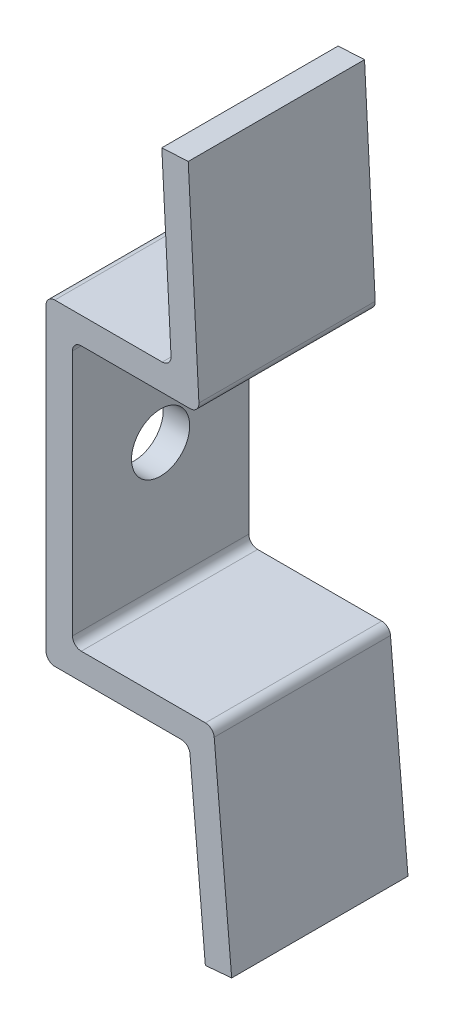
ISO-10303-21;
HEADER;
FILE_DESCRIPTION(('STEP AP214'),'2;1');
FILE_NAME('part.step','',(''),(''),'','','');
FILE_SCHEMA(('AUTOMOTIVE_DESIGN { 1 0 10303 214 1 1 1 1 }'));
ENDSEC;
DATA;
#1=APPLICATION_CONTEXT('core data for automotive mechanical design processes');
#2=APPLICATION_PROTOCOL_DEFINITION('international standard','automotive_design',2000,#1);
#3=PRODUCT_CONTEXT('',#1,'mechanical');
#4=PRODUCT('Part','Part','',(#3));
#5=PRODUCT_RELATED_PRODUCT_CATEGORY('part','',(#4));
#6=PRODUCT_DEFINITION_FORMATION('','',#4);
#7=PRODUCT_DEFINITION_CONTEXT('part definition',#1,'design');
#8=PRODUCT_DEFINITION('design','',#6,#7);
#9=PRODUCT_DEFINITION_SHAPE('','',#8);
#10=(LENGTH_UNIT() NAMED_UNIT(*) SI_UNIT(.MILLI.,.METRE.));
#11=(NAMED_UNIT(*) PLANE_ANGLE_UNIT() SI_UNIT($,.RADIAN.));
#12=(NAMED_UNIT(*) SI_UNIT($,.STERADIAN.) SOLID_ANGLE_UNIT());
#13=UNCERTAINTY_MEASURE_WITH_UNIT(LENGTH_MEASURE(1.E-05),#10,'distance_accuracy_value','');
#14=(GEOMETRIC_REPRESENTATION_CONTEXT(3) GLOBAL_UNCERTAINTY_ASSIGNED_CONTEXT((#13)) GLOBAL_UNIT_ASSIGNED_CONTEXT((#10,
#11,#12)) REPRESENTATION_CONTEXT('',''));
#15=CARTESIAN_POINT('',(0.,0.,0.));
#16=DIRECTION('',(0.,0.,1.));
#17=DIRECTION('',(1.,0.,0.));
#18=AXIS2_PLACEMENT_3D('',#15,#16,#17);
#19=CARTESIAN_POINT('',(18.0739848569751,-38.8367382190873,-10.));
#20=DIRECTION('',(0.0871557427476556,-0.996194698091746,0.));
#21=DIRECTION('',(0.996194698091746,0.0871557427476556,0.));
#22=AXIS2_PLACEMENT_3D('',#19,#20,#21);
#23=PLANE('',#22);
#24=DIRECTION('',(0.,0.,1.));
#25=VECTOR('',#24,1.);
#26=CARTESIAN_POINT('',(21.0625689512504,-38.5752709908443,-10.));
#27=LINE('',#26,#25);
#28=CARTESIAN_POINT('',(21.0625689512504,-38.5752709908443,-10.));
#29=VERTEX_POINT('',#28);
#30=CARTESIAN_POINT('',(21.0625689512504,-38.5752709908443,10.));
#31=VERTEX_POINT('',#30);
#32=EDGE_CURVE('E179',#29,#31,#27,.T.);
#33=ORIENTED_EDGE('',*,*,#32,.T.);
#34=DIRECTION('',(0.996194698091746,0.0871557427476556,0.));
#35=VECTOR('',#34,1.);
#36=CARTESIAN_POINT('',(18.0739848569751,-38.8367382190873,10.));
#37=LINE('',#36,#35);
#38=CARTESIAN_POINT('',(18.0739848569751,-38.8367382190873,10.));
#39=VERTEX_POINT('',#38);
#40=EDGE_CURVE('E182',#39,#31,#37,.T.);
#41=ORIENTED_EDGE('',*,*,#40,.F.);
#42=DIRECTION('',(0.,0.,1.));
#43=VECTOR('',#42,1.);
#44=CARTESIAN_POINT('',(18.0739848569751,-38.8367382190873,-10.));
#45=LINE('',#44,#43);
#46=CARTESIAN_POINT('',(18.0739848569751,-38.8367382190873,-10.));
#47=VERTEX_POINT('',#46);
#48=EDGE_CURVE('E13',#47,#39,#45,.T.);
#49=ORIENTED_EDGE('',*,*,#48,.F.);
#50=DIRECTION('',(0.996194698091746,0.0871557427476556,0.));
#51=VECTOR('',#50,1.);
#52=CARTESIAN_POINT('',(18.0739848569751,-38.8367382190873,-10.));
#53=LINE('',#52,#51);
#54=EDGE_CURVE('E183',#47,#29,#53,.T.);
#55=ORIENTED_EDGE('',*,*,#54,.T.);
#56=EDGE_LOOP('',(#33,#41,#49,#55));
#57=FACE_BOUND('',#56,.T.);
#58=ADVANCED_FACE('F45',(#57),#23,.T.);
#59=CARTESIAN_POINT('',(16.330870002022,-18.9128442572523,-10.));
#60=DIRECTION('',(-0.996194698091746,-0.0871557427476547,0.));
#61=DIRECTION('',(0.0871557427476547,-0.996194698091746,0.));
#62=AXIS2_PLACEMENT_3D('',#59,#60,#61);
#63=PLANE('',#62);
#64=ORIENTED_EDGE('',*,*,#48,.T.);
#65=DIRECTION('',(0.0871557427476547,-0.996194698091746,0.));
#66=VECTOR('',#65,1.);
#67=CARTESIAN_POINT('',(16.330870002022,-18.9128442572523,10.));
#68=LINE('',#67,#66);
#69=CARTESIAN_POINT('',(16.330870002022,-18.9128442572523,10.));
#70=VERTEX_POINT('',#69);
#71=EDGE_CURVE('E200',#70,#39,#68,.T.);
#72=ORIENTED_EDGE('',*,*,#71,.F.);
#73=DIRECTION('',(0.,0.,1.));
#74=VECTOR('',#73,1.);
#75=CARTESIAN_POINT('',(16.330870002022,-18.9128442572523,-10.));
#76=LINE('',#75,#74);
#77=CARTESIAN_POINT('',(16.330870002022,-18.9128442572523,-10.));
#78=VERTEX_POINT('',#77);
#79=EDGE_CURVE('E53',#78,#70,#76,.T.);
#80=ORIENTED_EDGE('',*,*,#79,.F.);
#81=DIRECTION('',(0.0871557427476547,-0.996194698091746,0.));
#82=VECTOR('',#81,1.);
#83=CARTESIAN_POINT('',(16.330870002022,-18.9128442572523,-10.));
#84=LINE('',#83,#82);
#85=EDGE_CURVE('E188',#78,#47,#84,.T.);
#86=ORIENTED_EDGE('',*,*,#85,.T.);
#87=EDGE_LOOP('',(#64,#72,#80,#86));
#88=FACE_BOUND('',#87,.T.);
#89=ADVANCED_FACE('F412',(#88),#63,.T.);
#90=CARTESIAN_POINT('',(15.3346753039303,-19.,-10.));
#91=DIRECTION('',(0.,0.,1.));
#92=DIRECTION('',(1.,0.,0.));
#93=AXIS2_PLACEMENT_3D('',#90,#91,#92);
#94=CYLINDRICAL_SURFACE('',#93,1.);
#95=ORIENTED_EDGE('',*,*,#79,.T.);
#96=CARTESIAN_POINT('',(15.3346753039303,-19.,10.));
#97=DIRECTION('',(0.,0.,-1.));
#98=DIRECTION('',(-1.,0.,0.));
#99=AXIS2_PLACEMENT_3D('',#96,#97,#98);
#100=CIRCLE('',#99,1.);
#101=CARTESIAN_POINT('',(15.3346753039303,-18.,10.));
#102=VERTEX_POINT('',#101);
#103=EDGE_CURVE('E252',#102,#70,#100,.T.);
#104=ORIENTED_EDGE('',*,*,#103,.F.);
#105=DIRECTION('',(0.,0.,1.));
#106=VECTOR('',#105,1.);
#107=CARTESIAN_POINT('',(15.3346753039303,-18.,-10.));
#108=LINE('',#107,#106);
#109=CARTESIAN_POINT('',(15.3346753039303,-18.,-10.));
#110=VERTEX_POINT('',#109);
#111=EDGE_CURVE('E310',#110,#102,#108,.T.);
#112=ORIENTED_EDGE('',*,*,#111,.F.);
#113=CARTESIAN_POINT('',(15.3346753039303,-19.,-10.));
#114=DIRECTION('',(0.,0.,-1.));
#115=DIRECTION('',(-1.,0.,0.));
#116=AXIS2_PLACEMENT_3D('',#113,#114,#115);
#117=CIRCLE('',#116,1.);
#118=EDGE_CURVE('E306',#110,#78,#117,.T.);
#119=ORIENTED_EDGE('',*,*,#118,.T.);
#120=EDGE_LOOP('',(#95,#104,#112,#119));
#121=FACE_BOUND('',#120,.T.);
#122=ADVANCED_FACE('F411',(#121),#94,.F.);
#123=CARTESIAN_POINT('',(1.00000000000001,-18.,-10.));
#124=DIRECTION('',(0.,-1.,0.));
#125=DIRECTION('',(0.,0.,-1.));
#126=AXIS2_PLACEMENT_3D('',#123,#124,#125);
#127=PLANE('',#126);
#128=ORIENTED_EDGE('',*,*,#111,.T.);
#129=DIRECTION('',(1.,0.,0.));
#130=VECTOR('',#129,1.);
#131=CARTESIAN_POINT('',(1.00000000000001,-18.,10.));
#132=LINE('',#131,#130);
#133=CARTESIAN_POINT('',(1.00000000000001,-18.,10.));
#134=VERTEX_POINT('',#133);
#135=EDGE_CURVE('E249',#134,#102,#132,.T.);
#136=ORIENTED_EDGE('',*,*,#135,.F.);
#137=DIRECTION('',(0.,0.,1.));
#138=VECTOR('',#137,1.);
#139=CARTESIAN_POINT('',(1.00000000000001,-18.,-10.));
#140=LINE('',#139,#138);
#141=CARTESIAN_POINT('',(1.00000000000001,-18.,-10.));
#142=VERTEX_POINT('',#141);
#143=EDGE_CURVE('E312',#142,#134,#140,.T.);
#144=ORIENTED_EDGE('',*,*,#143,.F.);
#145=DIRECTION('',(1.,0.,0.));
#146=VECTOR('',#145,1.);
#147=CARTESIAN_POINT('',(1.00000000000001,-18.,-10.));
#148=LINE('',#147,#146);
#149=EDGE_CURVE('E303',#142,#110,#148,.T.);
#150=ORIENTED_EDGE('',*,*,#149,.T.);
#151=EDGE_LOOP('',(#128,#136,#144,#150));
#152=FACE_BOUND('',#151,.T.);
#153=ADVANCED_FACE('F407',(#152),#127,.T.);
#154=CARTESIAN_POINT('',(1.,-17.,-10.));
#155=DIRECTION('',(0.,0.,1.));
#156=DIRECTION('',(1.,0.,0.));
#157=AXIS2_PLACEMENT_3D('',#154,#155,#156);
#158=CYLINDRICAL_SURFACE('',#157,1.);
#159=ORIENTED_EDGE('',*,*,#143,.T.);
#160=CARTESIAN_POINT('',(1.,-17.,10.));
#161=DIRECTION('',(0.,0.,1.));
#162=DIRECTION('',(1.,0.,0.));
#163=AXIS2_PLACEMENT_3D('',#160,#161,#162);
#164=CIRCLE('',#163,1.);
#165=CARTESIAN_POINT('',(0.,-17.,10.));
#166=VERTEX_POINT('',#165);
#167=EDGE_CURVE('E246',#166,#134,#164,.T.);
#168=ORIENTED_EDGE('',*,*,#167,.F.);
#169=DIRECTION('',(0.,0.,1.));
#170=VECTOR('',#169,1.);
#171=CARTESIAN_POINT('',(0.,-17.,-10.));
#172=LINE('',#171,#170);
#173=CARTESIAN_POINT('',(0.,-17.,-10.));
#174=VERTEX_POINT('',#173);
#175=EDGE_CURVE('E314',#174,#166,#172,.T.);
#176=ORIENTED_EDGE('',*,*,#175,.F.);
#177=CARTESIAN_POINT('',(1.,-17.,-10.));
#178=DIRECTION('',(0.,0.,1.));
#179=DIRECTION('',(1.,0.,0.));
#180=AXIS2_PLACEMENT_3D('',#177,#178,#179);
#181=CIRCLE('',#180,1.);
#182=EDGE_CURVE('E300',#174,#142,#181,.T.);
#183=ORIENTED_EDGE('',*,*,#182,.T.);
#184=EDGE_LOOP('',(#159,#168,#176,#183));
#185=FACE_BOUND('',#184,.T.);
#186=ADVANCED_FACE('F402',(#185),#158,.T.);
#187=CARTESIAN_POINT('',(0.,17.,-10.));
#188=DIRECTION('',(-1.,0.,0.));
#189=DIRECTION('',(0.,-1.,0.));
#190=AXIS2_PLACEMENT_3D('',#187,#188,#189);
#191=PLANE('',#190);
#192=CARTESIAN_POINT('',(0.,0.,0.));
#193=DIRECTION('',(-1.,0.,0.));
#194=DIRECTION('',(0.,0.,1.));
#195=AXIS2_PLACEMENT_3D('',#192,#193,#194);
#196=CIRCLE('',#195,3.29999999999989);
#197=CARTESIAN_POINT('',(0.,0.,3.29999999999989));
#198=VERTEX_POINT('',#197);
#199=EDGE_CURVE('E203',#198,#198,#196,.T.);
#200=ORIENTED_EDGE('',*,*,#199,.F.);
#201=EDGE_LOOP('',(#200));
#202=FACE_BOUND('',#201,.T.);
#203=ORIENTED_EDGE('',*,*,#175,.T.);
#204=DIRECTION('',(0.,-1.,0.));
#205=VECTOR('',#204,1.);
#206=CARTESIAN_POINT('',(0.,17.,10.));
#207=LINE('',#206,#205);
#208=CARTESIAN_POINT('',(0.,17.,10.));
#209=VERTEX_POINT('',#208);
#210=EDGE_CURVE('E243',#209,#166,#207,.T.);
#211=ORIENTED_EDGE('',*,*,#210,.F.);
#212=DIRECTION('',(0.,0.,1.));
#213=VECTOR('',#212,1.);
#214=CARTESIAN_POINT('',(0.,17.,-10.));
#215=LINE('',#214,#213);
#216=CARTESIAN_POINT('',(0.,17.,-10.));
#217=VERTEX_POINT('',#216);
#218=EDGE_CURVE('E316',#217,#209,#215,.T.);
#219=ORIENTED_EDGE('',*,*,#218,.F.);
#220=DIRECTION('',(0.,-1.,0.));
#221=VECTOR('',#220,1.);
#222=CARTESIAN_POINT('',(0.,17.,-10.));
#223=LINE('',#222,#221);
#224=EDGE_CURVE('E297',#217,#174,#223,.T.);
#225=ORIENTED_EDGE('',*,*,#224,.T.);
#226=EDGE_LOOP('',(#203,#211,#219,#225));
#227=FACE_BOUND('',#226,.T.);
#228=ADVANCED_FACE('F400',(#202,#227),#191,.T.);
#229=CARTESIAN_POINT('',(1.,17.,-10.));
#230=DIRECTION('',(0.,0.,1.));
#231=DIRECTION('',(1.,0.,0.));
#232=AXIS2_PLACEMENT_3D('',#229,#230,#231);
#233=CYLINDRICAL_SURFACE('',#232,1.);
#234=ORIENTED_EDGE('',*,*,#218,.T.);
#235=CARTESIAN_POINT('',(1.,17.,10.));
#236=DIRECTION('',(0.,0.,1.));
#237=DIRECTION('',(-1.,0.,0.));
#238=AXIS2_PLACEMENT_3D('',#235,#236,#237);
#239=CIRCLE('',#238,1.);
#240=CARTESIAN_POINT('',(1.00000000000001,18.,10.));
#241=VERTEX_POINT('',#240);
#242=EDGE_CURVE('E240',#241,#209,#239,.T.);
#243=ORIENTED_EDGE('',*,*,#242,.F.);
#244=DIRECTION('',(0.,0.,1.));
#245=VECTOR('',#244,1.);
#246=CARTESIAN_POINT('',(1.00000000000001,18.,-10.));
#247=LINE('',#246,#245);
#248=CARTESIAN_POINT('',(1.00000000000001,18.,-10.));
#249=VERTEX_POINT('',#248);
#250=EDGE_CURVE('E318',#249,#241,#247,.T.);
#251=ORIENTED_EDGE('',*,*,#250,.F.);
#252=CARTESIAN_POINT('',(1.,17.,-10.));
#253=DIRECTION('',(0.,0.,1.));
#254=DIRECTION('',(-1.,0.,0.));
#255=AXIS2_PLACEMENT_3D('',#252,#253,#254);
#256=CIRCLE('',#255,1.);
#257=EDGE_CURVE('E294',#249,#217,#256,.T.);
#258=ORIENTED_EDGE('',*,*,#257,.T.);
#259=EDGE_LOOP('',(#234,#243,#251,#258));
#260=FACE_BOUND('',#259,.T.);
#261=ADVANCED_FACE('F395',(#260),#233,.T.);
#262=CARTESIAN_POINT('',(13.1848794988761,18.,-10.));
#263=DIRECTION('',(0.,1.,0.));
#264=DIRECTION('',(-1.,0.,0.));
#265=AXIS2_PLACEMENT_3D('',#262,#263,#264);
#266=PLANE('',#265);
#267=ORIENTED_EDGE('',*,*,#250,.T.);
#268=DIRECTION('',(-1.,0.,0.));
#269=VECTOR('',#268,1.);
#270=CARTESIAN_POINT('',(13.1848794988761,18.,10.));
#271=LINE('',#270,#269);
#272=CARTESIAN_POINT('',(13.1848794988761,18.,10.));
#273=VERTEX_POINT('',#272);
#274=EDGE_CURVE('E237',#273,#241,#271,.T.);
#275=ORIENTED_EDGE('',*,*,#274,.F.);
#276=DIRECTION('',(0.,0.,1.));
#277=VECTOR('',#276,1.);
#278=CARTESIAN_POINT('',(13.1848794988761,18.,-10.));
#279=LINE('',#278,#277);
#280=CARTESIAN_POINT('',(13.1848794988761,18.,-10.));
#281=VERTEX_POINT('',#280);
#282=EDGE_CURVE('E320',#281,#273,#279,.T.);
#283=ORIENTED_EDGE('',*,*,#282,.F.);
#284=DIRECTION('',(-1.,0.,0.));
#285=VECTOR('',#284,1.);
#286=CARTESIAN_POINT('',(13.1848794988761,18.,-10.));
#287=LINE('',#286,#285);
#288=EDGE_CURVE('E291',#281,#249,#287,.T.);
#289=ORIENTED_EDGE('',*,*,#288,.T.);
#290=EDGE_LOOP('',(#267,#275,#283,#289));
#291=FACE_BOUND('',#290,.T.);
#292=ADVANCED_FACE('F390',(#291),#266,.T.);
#293=CARTESIAN_POINT('',(13.1848794988761,19.,-10.));
#294=DIRECTION('',(0.,0.,1.));
#295=DIRECTION('',(1.,0.,0.));
#296=AXIS2_PLACEMENT_3D('',#293,#294,#295);
#297=CYLINDRICAL_SURFACE('',#296,0.999999999999997);
#298=ORIENTED_EDGE('',*,*,#282,.T.);
#299=CARTESIAN_POINT('',(13.1848794988761,19.,10.));
#300=DIRECTION('',(0.,0.,-1.));
#301=DIRECTION('',(-1.,0.,0.));
#302=AXIS2_PLACEMENT_3D('',#299,#300,#301);
#303=CIRCLE('',#302,0.999999999999997);
#304=CARTESIAN_POINT('',(14.1835090336307,19.0523359562429,10.));
#305=VERTEX_POINT('',#304);
#306=EDGE_CURVE('E234',#305,#273,#303,.T.);
#307=ORIENTED_EDGE('',*,*,#306,.F.);
#308=DIRECTION('',(0.,0.,1.));
#309=VECTOR('',#308,1.);
#310=CARTESIAN_POINT('',(14.1835090336307,19.0523359562429,-10.));
#311=LINE('',#310,#309);
#312=CARTESIAN_POINT('',(14.1835090336307,19.0523359562429,-10.));
#313=VERTEX_POINT('',#312);
#314=EDGE_CURVE('E322',#313,#305,#311,.T.);
#315=ORIENTED_EDGE('',*,*,#314,.F.);
#316=CARTESIAN_POINT('',(13.1848794988761,19.,-10.));
#317=DIRECTION('',(0.,0.,-1.));
#318=DIRECTION('',(-1.,0.,0.));
#319=AXIS2_PLACEMENT_3D('',#316,#317,#318);
#320=CIRCLE('',#319,0.999999999999997);
#321=EDGE_CURVE('E288',#313,#281,#320,.T.);
#322=ORIENTED_EDGE('',*,*,#321,.T.);
#323=EDGE_LOOP('',(#298,#307,#315,#322));
#324=FACE_BOUND('',#323,.T.);
#325=ADVANCED_FACE('F388',(#324),#297,.F.);
#326=CARTESIAN_POINT('',(13.1367899087717,39.0249266513344,-10.));
#327=DIRECTION('',(-0.998629534754574,-0.0523359562429478,0.));
#328=DIRECTION('',(0.0523359562429478,-0.998629534754574,0.));
#329=AXIS2_PLACEMENT_3D('',#326,#327,#328);
#330=PLANE('',#329);
#331=ORIENTED_EDGE('',*,*,#314,.T.);
#332=DIRECTION('',(0.0523359562429478,-0.998629534754574,0.));
#333=VECTOR('',#332,1.);
#334=CARTESIAN_POINT('',(13.1367899087717,39.0249266513344,10.));
#335=LINE('',#334,#333);
#336=CARTESIAN_POINT('',(13.1367899087717,39.0249266513344,10.));
#337=VERTEX_POINT('',#336);
#338=EDGE_CURVE('E231',#337,#305,#335,.T.);
#339=ORIENTED_EDGE('',*,*,#338,.F.);
#340=DIRECTION('',(0.,0.,1.));
#341=VECTOR('',#340,1.);
#342=CARTESIAN_POINT('',(13.1367899087717,39.0249266513344,-10.));
#343=LINE('',#342,#341);
#344=CARTESIAN_POINT('',(13.1367899087717,39.0249266513344,-10.));
#345=VERTEX_POINT('',#344);
#346=EDGE_CURVE('E324',#345,#337,#343,.T.);
#347=ORIENTED_EDGE('',*,*,#346,.F.);
#348=DIRECTION('',(0.0523359562429478,-0.998629534754574,0.));
#349=VECTOR('',#348,1.);
#350=CARTESIAN_POINT('',(13.1367899087717,39.0249266513344,-10.));
#351=LINE('',#350,#349);
#352=EDGE_CURVE('E285',#345,#313,#351,.T.);
#353=ORIENTED_EDGE('',*,*,#352,.T.);
#354=EDGE_LOOP('',(#331,#339,#347,#353));
#355=FACE_BOUND('',#354,.T.);
#356=ADVANCED_FACE('F383',(#355),#330,.T.);
#357=CARTESIAN_POINT('',(16.1326785130355,39.1819345200633,-10.));
#358=DIRECTION('',(-0.0523359562429488,0.998629534754574,0.));
#359=DIRECTION('',(-0.998629534754574,-0.0523359562429488,0.));
#360=AXIS2_PLACEMENT_3D('',#357,#358,#359);
#361=PLANE('',#360);
#362=ORIENTED_EDGE('',*,*,#346,.T.);
#363=DIRECTION('',(-0.998629534754574,-0.0523359562429488,0.));
#364=VECTOR('',#363,1.);
#365=CARTESIAN_POINT('',(16.1326785130355,39.1819345200633,10.));
#366=LINE('',#365,#364);
#367=CARTESIAN_POINT('',(16.1326785130355,39.1819345200633,10.));
#368=VERTEX_POINT('',#367);
#369=EDGE_CURVE('E228',#368,#337,#366,.T.);
#370=ORIENTED_EDGE('',*,*,#369,.F.);
#371=DIRECTION('',(0.,0.,1.));
#372=VECTOR('',#371,1.);
#373=CARTESIAN_POINT('',(16.1326785130355,39.1819345200633,-10.));
#374=LINE('',#373,#372);
#375=CARTESIAN_POINT('',(16.1326785130355,39.1819345200633,-10.));
#376=VERTEX_POINT('',#375);
#377=EDGE_CURVE('E326',#376,#368,#374,.T.);
#378=ORIENTED_EDGE('',*,*,#377,.F.);
#379=DIRECTION('',(-0.998629534754574,-0.0523359562429488,0.));
#380=VECTOR('',#379,1.);
#381=CARTESIAN_POINT('',(16.1326785130355,39.1819345200633,-10.));
#382=LINE('',#381,#380);
#383=EDGE_CURVE('E282',#376,#345,#382,.T.);
#384=ORIENTED_EDGE('',*,*,#383,.T.);
#385=EDGE_LOOP('',(#362,#370,#378,#384));
#386=FACE_BOUND('',#385,.T.);
#387=ADVANCED_FACE('F378',(#386),#361,.T.);
#388=CARTESIAN_POINT('',(17.3448494094736,16.0523359562429,-10.));
#389=DIRECTION('',(0.998629534754574,0.0523359562429481,0.));
#390=DIRECTION('',(-0.0523359562429481,0.998629534754574,0.));
#391=AXIS2_PLACEMENT_3D('',#388,#389,#390);
#392=PLANE('',#391);
#393=ORIENTED_EDGE('',*,*,#377,.T.);
#394=DIRECTION('',(-0.0523359562429481,0.998629534754574,0.));
#395=VECTOR('',#394,1.);
#396=CARTESIAN_POINT('',(17.3448494094736,16.0523359562429,10.));
#397=LINE('',#396,#395);
#398=CARTESIAN_POINT('',(17.3448494094736,16.0523359562429,10.));
#399=VERTEX_POINT('',#398);
#400=EDGE_CURVE('E225',#399,#368,#397,.T.);
#401=ORIENTED_EDGE('',*,*,#400,.F.);
#402=DIRECTION('',(0.,0.,1.));
#403=VECTOR('',#402,1.);
#404=CARTESIAN_POINT('',(17.3448494094736,16.0523359562429,-10.));
#405=LINE('',#404,#403);
#406=CARTESIAN_POINT('',(17.3448494094736,16.0523359562429,-10.));
#407=VERTEX_POINT('',#406);
#408=EDGE_CURVE('E328',#407,#399,#405,.T.);
#409=ORIENTED_EDGE('',*,*,#408,.F.);
#410=DIRECTION('',(-0.0523359562429481,0.998629534754574,0.));
#411=VECTOR('',#410,1.);
#412=CARTESIAN_POINT('',(17.3448494094736,16.0523359562429,-10.));
#413=LINE('',#412,#411);
#414=EDGE_CURVE('E279',#407,#376,#413,.T.);
#415=ORIENTED_EDGE('',*,*,#414,.T.);
#416=EDGE_LOOP('',(#393,#401,#409,#415));
#417=FACE_BOUND('',#416,.T.);
#418=ADVANCED_FACE('F376',(#417),#392,.T.);
#419=CARTESIAN_POINT('',(16.346219874719,16.,-10.));
#420=DIRECTION('',(0.,0.,1.));
#421=DIRECTION('',(1.,0.,0.));
#422=AXIS2_PLACEMENT_3D('',#419,#420,#421);
#423=CYLINDRICAL_SURFACE('',#422,1.);
#424=ORIENTED_EDGE('',*,*,#408,.T.);
#425=CARTESIAN_POINT('',(16.346219874719,16.,10.));
#426=DIRECTION('',(0.,0.,1.));
#427=DIRECTION('',(1.,0.,0.));
#428=AXIS2_PLACEMENT_3D('',#425,#426,#427);
#429=CIRCLE('',#428,1.);
#430=CARTESIAN_POINT('',(16.346219874719,15.,10.));
#431=VERTEX_POINT('',#430);
#432=EDGE_CURVE('E222',#431,#399,#429,.T.);
#433=ORIENTED_EDGE('',*,*,#432,.F.);
#434=DIRECTION('',(0.,0.,1.));
#435=VECTOR('',#434,1.);
#436=CARTESIAN_POINT('',(16.346219874719,15.,-10.));
#437=LINE('',#436,#435);
#438=CARTESIAN_POINT('',(16.346219874719,15.,-10.));
#439=VERTEX_POINT('',#438);
#440=EDGE_CURVE('E330',#439,#431,#437,.T.);
#441=ORIENTED_EDGE('',*,*,#440,.F.);
#442=CARTESIAN_POINT('',(16.346219874719,16.,-10.));
#443=DIRECTION('',(0.,0.,1.));
#444=DIRECTION('',(1.,0.,0.));
#445=AXIS2_PLACEMENT_3D('',#442,#443,#444);
#446=CIRCLE('',#445,1.);
#447=EDGE_CURVE('E276',#439,#407,#446,.T.);
#448=ORIENTED_EDGE('',*,*,#447,.T.);
#449=EDGE_LOOP('',(#424,#433,#441,#448));
#450=FACE_BOUND('',#449,.T.);
#451=ADVANCED_FACE('F371',(#450),#423,.T.);
#452=CARTESIAN_POINT('',(4.00000000000001,15.,-10.));
#453=DIRECTION('',(0.,-1.,0.));
#454=DIRECTION('',(1.,0.,0.));
#455=AXIS2_PLACEMENT_3D('',#452,#453,#454);
#456=PLANE('',#455);
#457=ORIENTED_EDGE('',*,*,#440,.T.);
#458=DIRECTION('',(1.,0.,0.));
#459=VECTOR('',#458,1.);
#460=CARTESIAN_POINT('',(4.00000000000001,15.,10.));
#461=LINE('',#460,#459);
#462=CARTESIAN_POINT('',(4.00000000000001,15.,10.));
#463=VERTEX_POINT('',#462);
#464=EDGE_CURVE('E219',#463,#431,#461,.T.);
#465=ORIENTED_EDGE('',*,*,#464,.F.);
#466=DIRECTION('',(0.,0.,1.));
#467=VECTOR('',#466,1.);
#468=CARTESIAN_POINT('',(4.00000000000001,15.,-10.));
#469=LINE('',#468,#467);
#470=CARTESIAN_POINT('',(4.00000000000001,15.,-10.));
#471=VERTEX_POINT('',#470);
#472=EDGE_CURVE('E332',#471,#463,#469,.T.);
#473=ORIENTED_EDGE('',*,*,#472,.F.);
#474=DIRECTION('',(1.,0.,0.));
#475=VECTOR('',#474,1.);
#476=CARTESIAN_POINT('',(4.00000000000001,15.,-10.));
#477=LINE('',#476,#475);
#478=EDGE_CURVE('E273',#471,#439,#477,.T.);
#479=ORIENTED_EDGE('',*,*,#478,.T.);
#480=EDGE_LOOP('',(#457,#465,#473,#479));
#481=FACE_BOUND('',#480,.T.);
#482=ADVANCED_FACE('F366',(#481),#456,.T.);
#483=CARTESIAN_POINT('',(4.,14.,-10.));
#484=DIRECTION('',(0.,0.,1.));
#485=DIRECTION('',(1.,0.,0.));
#486=AXIS2_PLACEMENT_3D('',#483,#484,#485);
#487=CYLINDRICAL_SURFACE('',#486,0.999999999999999);
#488=ORIENTED_EDGE('',*,*,#472,.T.);
#489=CARTESIAN_POINT('',(4.,14.,10.));
#490=DIRECTION('',(0.,0.,-1.));
#491=DIRECTION('',(-1.,0.,0.));
#492=AXIS2_PLACEMENT_3D('',#489,#490,#491);
#493=CIRCLE('',#492,0.999999999999999);
#494=CARTESIAN_POINT('',(3.,14.,10.));
#495=VERTEX_POINT('',#494);
#496=EDGE_CURVE('E216',#495,#463,#493,.T.);
#497=ORIENTED_EDGE('',*,*,#496,.F.);
#498=DIRECTION('',(0.,0.,1.));
#499=VECTOR('',#498,1.);
#500=CARTESIAN_POINT('',(3.,14.,-10.));
#501=LINE('',#500,#499);
#502=CARTESIAN_POINT('',(3.,14.,-10.));
#503=VERTEX_POINT('',#502);
#504=EDGE_CURVE('E334',#503,#495,#501,.T.);
#505=ORIENTED_EDGE('',*,*,#504,.F.);
#506=CARTESIAN_POINT('',(4.,14.,-10.));
#507=DIRECTION('',(0.,0.,-1.));
#508=DIRECTION('',(-1.,0.,0.));
#509=AXIS2_PLACEMENT_3D('',#506,#507,#508);
#510=CIRCLE('',#509,0.999999999999999);
#511=EDGE_CURVE('E270',#503,#471,#510,.T.);
#512=ORIENTED_EDGE('',*,*,#511,.T.);
#513=EDGE_LOOP('',(#488,#497,#505,#512));
#514=FACE_BOUND('',#513,.T.);
#515=ADVANCED_FACE('F364',(#514),#487,.F.);
#516=CARTESIAN_POINT('',(3.,-14.,-10.));
#517=DIRECTION('',(1.,0.,0.));
#518=DIRECTION('',(0.,0.,-1.));
#519=AXIS2_PLACEMENT_3D('',#516,#517,#518);
#520=PLANE('',#519);
#521=CARTESIAN_POINT('',(3.,0.,0.));
#522=DIRECTION('',(1.,0.,0.));
#523=DIRECTION('',(0.,0.,-1.));
#524=AXIS2_PLACEMENT_3D('',#521,#522,#523);
#525=CIRCLE('',#524,3.29999999999994);
#526=CARTESIAN_POINT('',(3.,0.,-3.29999999999994));
#527=VERTEX_POINT('',#526);
#528=EDGE_CURVE('E48',#527,#527,#525,.T.);
#529=ORIENTED_EDGE('',*,*,#528,.F.);
#530=EDGE_LOOP('',(#529));
#531=FACE_BOUND('',#530,.T.);
#532=ORIENTED_EDGE('',*,*,#504,.T.);
#533=DIRECTION('',(0.,1.,0.));
#534=VECTOR('',#533,1.);
#535=CARTESIAN_POINT('',(3.,-14.,10.));
#536=LINE('',#535,#534);
#537=CARTESIAN_POINT('',(3.,-14.,10.));
#538=VERTEX_POINT('',#537);
#539=EDGE_CURVE('E213',#538,#495,#536,.T.);
#540=ORIENTED_EDGE('',*,*,#539,.F.);
#541=DIRECTION('',(0.,0.,1.));
#542=VECTOR('',#541,1.);
#543=CARTESIAN_POINT('',(3.,-14.,-10.));
#544=LINE('',#543,#542);
#545=CARTESIAN_POINT('',(3.,-14.,-10.));
#546=VERTEX_POINT('',#545);
#547=EDGE_CURVE('E336',#546,#538,#544,.T.);
#548=ORIENTED_EDGE('',*,*,#547,.F.);
#549=DIRECTION('',(0.,1.,0.));
#550=VECTOR('',#549,1.);
#551=CARTESIAN_POINT('',(3.,-14.,-10.));
#552=LINE('',#551,#550);
#553=EDGE_CURVE('E267',#546,#503,#552,.T.);
#554=ORIENTED_EDGE('',*,*,#553,.T.);
#555=EDGE_LOOP('',(#532,#540,#548,#554));
#556=FACE_BOUND('',#555,.T.);
#557=ADVANCED_FACE('F359',(#531,#556),#520,.T.);
#558=CARTESIAN_POINT('',(4.,-14.,-10.));
#559=DIRECTION('',(0.,0.,1.));
#560=DIRECTION('',(1.,0.,0.));
#561=AXIS2_PLACEMENT_3D('',#558,#559,#560);
#562=CYLINDRICAL_SURFACE('',#561,0.999999999999999);
#563=ORIENTED_EDGE('',*,*,#547,.T.);
#564=CARTESIAN_POINT('',(4.,-14.,10.));
#565=DIRECTION('',(0.,0.,-1.));
#566=DIRECTION('',(-1.,0.,0.));
#567=AXIS2_PLACEMENT_3D('',#564,#565,#566);
#568=CIRCLE('',#567,0.999999999999999);
#569=CARTESIAN_POINT('',(4.00000000000001,-15.,10.));
#570=VERTEX_POINT('',#569);
#571=EDGE_CURVE('E210',#570,#538,#568,.T.);
#572=ORIENTED_EDGE('',*,*,#571,.F.);
#573=DIRECTION('',(0.,0.,1.));
#574=VECTOR('',#573,1.);
#575=CARTESIAN_POINT('',(4.00000000000001,-15.,-10.));
#576=LINE('',#575,#574);
#577=CARTESIAN_POINT('',(4.00000000000001,-15.,-10.));
#578=VERTEX_POINT('',#577);
#579=EDGE_CURVE('E338',#578,#570,#576,.T.);
#580=ORIENTED_EDGE('',*,*,#579,.F.);
#581=CARTESIAN_POINT('',(4.,-14.,-10.));
#582=DIRECTION('',(0.,0.,-1.));
#583=DIRECTION('',(-1.,0.,0.));
#584=AXIS2_PLACEMENT_3D('',#581,#582,#583);
#585=CIRCLE('',#584,0.999999999999999);
#586=EDGE_CURVE('E264',#578,#546,#585,.T.);
#587=ORIENTED_EDGE('',*,*,#586,.T.);
#588=EDGE_LOOP('',(#563,#572,#580,#587));
#589=FACE_BOUND('',#588,.T.);
#590=ADVANCED_FACE('F352',(#589),#562,.F.);
#591=CARTESIAN_POINT('',(18.0836688259826,-15.,-10.));
#592=DIRECTION('',(0.,1.,0.));
#593=DIRECTION('',(-1.,0.,0.));
#594=AXIS2_PLACEMENT_3D('',#591,#592,#593);
#595=PLANE('',#594);
#596=ORIENTED_EDGE('',*,*,#579,.T.);
#597=DIRECTION('',(-1.,0.,0.));
#598=VECTOR('',#597,1.);
#599=CARTESIAN_POINT('',(18.0836688259826,-15.,10.));
#600=LINE('',#599,#598);
#601=CARTESIAN_POINT('',(18.0836688259826,-15.,10.));
#602=VERTEX_POINT('',#601);
#603=EDGE_CURVE('E207',#602,#570,#600,.T.);
#604=ORIENTED_EDGE('',*,*,#603,.F.);
#605=DIRECTION('',(0.,0.,1.));
#606=VECTOR('',#605,1.);
#607=CARTESIAN_POINT('',(18.0836688259826,-15.,-10.));
#608=LINE('',#607,#606);
#609=CARTESIAN_POINT('',(18.0836688259826,-15.,-10.));
#610=VERTEX_POINT('',#609);
#611=EDGE_CURVE('E340',#610,#602,#608,.T.);
#612=ORIENTED_EDGE('',*,*,#611,.F.);
#613=DIRECTION('',(-1.,0.,0.));
#614=VECTOR('',#613,1.);
#615=CARTESIAN_POINT('',(18.0836688259826,-15.,-10.));
#616=LINE('',#615,#614);
#617=EDGE_CURVE('E261',#610,#578,#616,.T.);
#618=ORIENTED_EDGE('',*,*,#617,.T.);
#619=EDGE_LOOP('',(#596,#604,#612,#618));
#620=FACE_BOUND('',#619,.T.);
#621=ADVANCED_FACE('F349',(#620),#595,.T.);
#622=CARTESIAN_POINT('',(18.0836688259826,-16.,-10.));
#623=DIRECTION('',(0.,0.,1.));
#624=DIRECTION('',(1.,0.,0.));
#625=AXIS2_PLACEMENT_3D('',#622,#623,#624);
#626=CYLINDRICAL_SURFACE('',#625,1.);
#627=ORIENTED_EDGE('',*,*,#611,.T.);
#628=CARTESIAN_POINT('',(18.0836688259826,-16.,10.));
#629=DIRECTION('',(0.,0.,1.));
#630=DIRECTION('',(1.,0.,0.));
#631=AXIS2_PLACEMENT_3D('',#628,#629,#630);
#632=CIRCLE('',#631,1.);
#633=CARTESIAN_POINT('',(19.0798635240743,-15.9128442572523,10.));
#634=VERTEX_POINT('',#633);
#635=EDGE_CURVE('E195',#634,#602,#632,.T.);
#636=ORIENTED_EDGE('',*,*,#635,.F.);
#637=DIRECTION('',(0.,0.,1.));
#638=VECTOR('',#637,1.);
#639=CARTESIAN_POINT('',(19.0798635240743,-15.9128442572523,-10.));
#640=LINE('',#639,#638);
#641=CARTESIAN_POINT('',(19.0798635240743,-15.9128442572523,-10.));
#642=VERTEX_POINT('',#641);
#643=EDGE_CURVE('E187',#642,#634,#640,.T.);
#644=ORIENTED_EDGE('',*,*,#643,.F.);
#645=CARTESIAN_POINT('',(18.0836688259826,-16.,-10.));
#646=DIRECTION('',(0.,0.,1.));
#647=DIRECTION('',(1.,0.,0.));
#648=AXIS2_PLACEMENT_3D('',#645,#646,#647);
#649=CIRCLE('',#648,1.);
#650=EDGE_CURVE('E258',#642,#610,#649,.T.);
#651=ORIENTED_EDGE('',*,*,#650,.T.);
#652=EDGE_LOOP('',(#627,#636,#644,#651));
#653=FACE_BOUND('',#652,.T.);
#654=ADVANCED_FACE('F343',(#653),#626,.T.);
#655=CARTESIAN_POINT('',(21.0625689512504,-38.5752709908443,-10.));
#656=DIRECTION('',(0.996194698091746,0.0871557427476552,0.));
#657=DIRECTION('',(-0.0871557427476552,0.996194698091746,0.));
#658=AXIS2_PLACEMENT_3D('',#655,#656,#657);
#659=PLANE('',#658);
#660=ORIENTED_EDGE('',*,*,#643,.T.);
#661=DIRECTION('',(-0.0871557427476552,0.996194698091746,0.));
#662=VECTOR('',#661,1.);
#663=CARTESIAN_POINT('',(21.0625689512504,-38.5752709908443,10.));
#664=LINE('',#663,#662);
#665=EDGE_CURVE('E190',#31,#634,#664,.T.);
#666=ORIENTED_EDGE('',*,*,#665,.F.);
#667=ORIENTED_EDGE('',*,*,#32,.F.);
#668=DIRECTION('',(-0.0871557427476552,0.996194698091746,0.));
#669=VECTOR('',#668,1.);
#670=CARTESIAN_POINT('',(21.0625689512504,-38.5752709908443,-10.));
#671=LINE('',#670,#669);
#672=EDGE_CURVE('E256',#29,#642,#671,.T.);
#673=ORIENTED_EDGE('',*,*,#672,.T.);
#674=EDGE_LOOP('',(#660,#666,#667,#673));
#675=FACE_BOUND('',#674,.T.);
#676=ADVANCED_FACE('F191',(#675),#659,.T.);
#677=CARTESIAN_POINT('',(18.0836688259826,-16.,-10.));
#678=DIRECTION('',(0.,0.,1.));
#679=DIRECTION('',(1.,0.,0.));
#680=AXIS2_PLACEMENT_3D('',#677,#678,#679);
#681=PLANE('',#680);
#682=ORIENTED_EDGE('',*,*,#54,.F.);
#683=ORIENTED_EDGE('',*,*,#85,.F.);
#684=ORIENTED_EDGE('',*,*,#118,.F.);
#685=ORIENTED_EDGE('',*,*,#149,.F.);
#686=ORIENTED_EDGE('',*,*,#182,.F.);
#687=ORIENTED_EDGE('',*,*,#224,.F.);
#688=ORIENTED_EDGE('',*,*,#257,.F.);
#689=ORIENTED_EDGE('',*,*,#288,.F.);
#690=ORIENTED_EDGE('',*,*,#321,.F.);
#691=ORIENTED_EDGE('',*,*,#352,.F.);
#692=ORIENTED_EDGE('',*,*,#383,.F.);
#693=ORIENTED_EDGE('',*,*,#414,.F.);
#694=ORIENTED_EDGE('',*,*,#447,.F.);
#695=ORIENTED_EDGE('',*,*,#478,.F.);
#696=ORIENTED_EDGE('',*,*,#511,.F.);
#697=ORIENTED_EDGE('',*,*,#553,.F.);
#698=ORIENTED_EDGE('',*,*,#586,.F.);
#699=ORIENTED_EDGE('',*,*,#617,.F.);
#700=ORIENTED_EDGE('',*,*,#650,.F.);
#701=ORIENTED_EDGE('',*,*,#672,.F.);
#702=EDGE_LOOP('',(#682,#683,#684,#685,#686,#687,#688,#689,#690,#691,#692,#693,#694,#695,#696,
#697,#698,#699,#700,#701));
#703=FACE_BOUND('',#702,.T.);
#704=ADVANCED_FACE('F355',(#703),#681,.F.);
#705=CARTESIAN_POINT('',(18.0836688259826,-16.,10.));
#706=DIRECTION('',(0.,0.,1.));
#707=DIRECTION('',(1.,0.,0.));
#708=AXIS2_PLACEMENT_3D('',#705,#706,#707);
#709=PLANE('',#708);
#710=ORIENTED_EDGE('',*,*,#40,.T.);
#711=ORIENTED_EDGE('',*,*,#665,.T.);
#712=ORIENTED_EDGE('',*,*,#635,.T.);
#713=ORIENTED_EDGE('',*,*,#603,.T.);
#714=ORIENTED_EDGE('',*,*,#571,.T.);
#715=ORIENTED_EDGE('',*,*,#539,.T.);
#716=ORIENTED_EDGE('',*,*,#496,.T.);
#717=ORIENTED_EDGE('',*,*,#464,.T.);
#718=ORIENTED_EDGE('',*,*,#432,.T.);
#719=ORIENTED_EDGE('',*,*,#400,.T.);
#720=ORIENTED_EDGE('',*,*,#369,.T.);
#721=ORIENTED_EDGE('',*,*,#338,.T.);
#722=ORIENTED_EDGE('',*,*,#306,.T.);
#723=ORIENTED_EDGE('',*,*,#274,.T.);
#724=ORIENTED_EDGE('',*,*,#242,.T.);
#725=ORIENTED_EDGE('',*,*,#210,.T.);
#726=ORIENTED_EDGE('',*,*,#167,.T.);
#727=ORIENTED_EDGE('',*,*,#135,.T.);
#728=ORIENTED_EDGE('',*,*,#103,.T.);
#729=ORIENTED_EDGE('',*,*,#71,.T.);
#730=EDGE_LOOP('',(#710,#711,#712,#713,#714,#715,#716,#717,#718,#719,#720,#721,#722,#723,#724,
#725,#726,#727,#728,#729));
#731=FACE_BOUND('',#730,.T.);
#732=ADVANCED_FACE('F198',(#731),#709,.T.);
#733=CARTESIAN_POINT('',(0.,0.,0.));
#734=DIRECTION('',(-1.,0.,0.));
#735=DIRECTION('',(0.,0.,1.));
#736=AXIS2_PLACEMENT_3D('',#733,#734,#735);
#737=CYLINDRICAL_SURFACE('',#736,3.29999999999994);
#738=ORIENTED_EDGE('',*,*,#528,.T.);
#739=EDGE_LOOP('',(#738));
#740=FACE_BOUND('',#739,.T.);
#741=ORIENTED_EDGE('',*,*,#199,.T.);
#742=EDGE_LOOP('',(#741));
#743=FACE_BOUND('',#742,.T.);
#744=ADVANCED_FACE('F463',(#740,#743),#737,.F.);
#745=CLOSED_SHELL('',(#58,#89,#122,#153,#186,#228,#261,#292,#325,#356,#387,#418,#451,#482,#515,
#557,#590,#621,#654,#676,#704,#732,#744));
#746=MANIFOLD_SOLID_BREP('B2',#745);
#747=ADVANCED_BREP_SHAPE_REPRESENTATION('',(#18,#746),#14);
#748=SHAPE_DEFINITION_REPRESENTATION(#9,#747);
ENDSEC;
END-ISO-10303-21;
